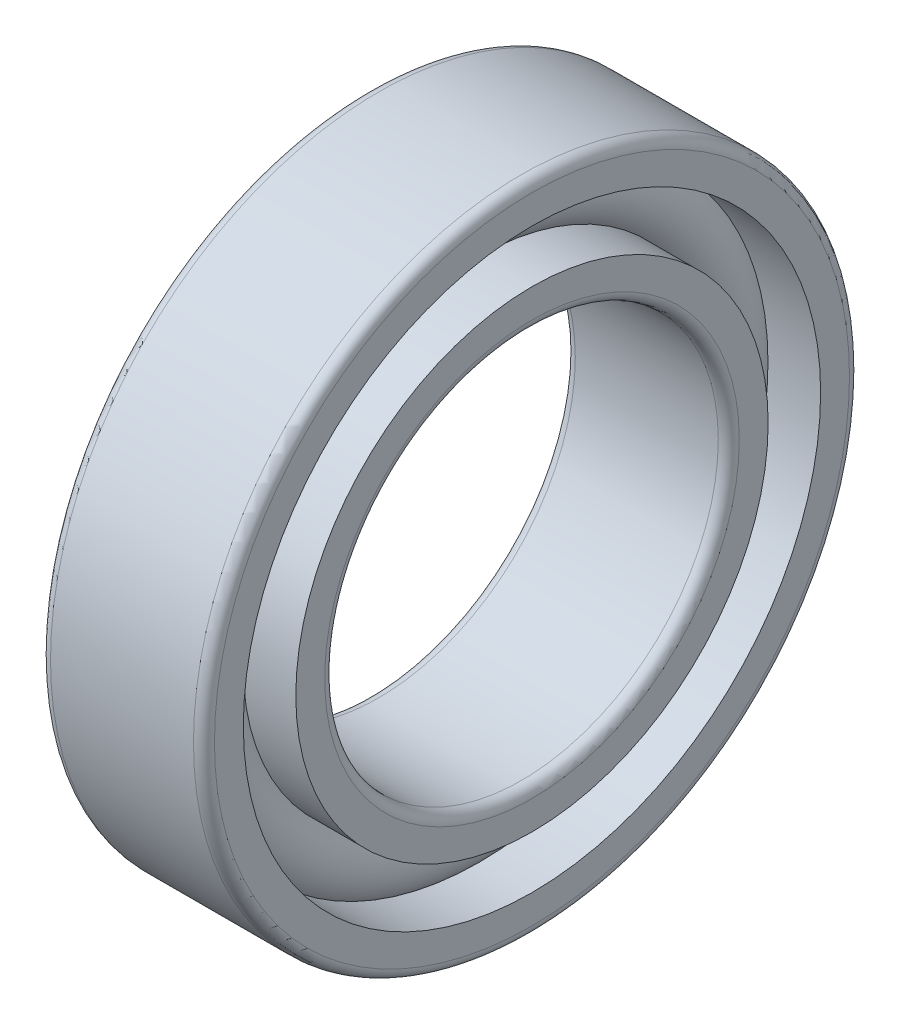
ISO-10303-21;
HEADER;
FILE_DESCRIPTION(('STEP AP214'),'2;1');
FILE_NAME('part.step','',(''),(''),'','','');
FILE_SCHEMA(('AUTOMOTIVE_DESIGN { 1 0 10303 214 1 1 1 1 }'));
ENDSEC;
DATA;
#1=APPLICATION_CONTEXT('core data for automotive mechanical design processes');
#2=APPLICATION_PROTOCOL_DEFINITION('international standard','automotive_design',2000,#1);
#3=PRODUCT_CONTEXT('',#1,'mechanical');
#4=PRODUCT('Part','Part','',(#3));
#5=PRODUCT_RELATED_PRODUCT_CATEGORY('part','',(#4));
#6=PRODUCT_DEFINITION_FORMATION('','',#4);
#7=PRODUCT_DEFINITION_CONTEXT('part definition',#1,'design');
#8=PRODUCT_DEFINITION('design','',#6,#7);
#9=PRODUCT_DEFINITION_SHAPE('','',#8);
#10=(LENGTH_UNIT() NAMED_UNIT(*) SI_UNIT(.MILLI.,.METRE.));
#11=(NAMED_UNIT(*) PLANE_ANGLE_UNIT() SI_UNIT($,.RADIAN.));
#12=(NAMED_UNIT(*) SI_UNIT($,.STERADIAN.) SOLID_ANGLE_UNIT());
#13=UNCERTAINTY_MEASURE_WITH_UNIT(LENGTH_MEASURE(1.E-05),#10,'distance_accuracy_value','');
#14=(GEOMETRIC_REPRESENTATION_CONTEXT(3) GLOBAL_UNCERTAINTY_ASSIGNED_CONTEXT((#13)) GLOBAL_UNIT_ASSIGNED_CONTEXT((#10,
#11,#12)) REPRESENTATION_CONTEXT('',''));
#15=CARTESIAN_POINT('',(0.,0.,0.));
#16=DIRECTION('',(0.,0.,1.));
#17=DIRECTION('',(1.,0.,0.));
#18=AXIS2_PLACEMENT_3D('',#15,#16,#17);
#19=CARTESIAN_POINT('',(0.,0.,0.));
#20=DIRECTION('',(-1.,0.,0.));
#21=DIRECTION('',(0.,0.,1.));
#22=AXIS2_PLACEMENT_3D('',#19,#20,#21);
#23=TOROIDAL_SURFACE('',#22,6.35,0.9525);
#24=CARTESIAN_POINT('',(0.709951582856178,0.,0.));
#25=DIRECTION('',(-1.,0.,0.));
#26=DIRECTION('',(0.,0.,1.));
#27=AXIS2_PLACEMENT_3D('',#24,#25,#26);
#28=CIRCLE('',#27,6.985);
#29=CARTESIAN_POINT('',(0.709951582856178,0.,6.985));
#30=VERTEX_POINT('',#29);
#31=EDGE_CURVE('E41',#30,#30,#28,.F.);
#32=ORIENTED_EDGE('',*,*,#31,.T.);
#33=EDGE_LOOP('',(#32));
#34=FACE_BOUND('',#33,.T.);
#35=CARTESIAN_POINT('',(0.709951582856183,0.,0.));
#36=DIRECTION('',(-1.,0.,0.));
#37=DIRECTION('',(0.,0.,1.));
#38=AXIS2_PLACEMENT_3D('',#35,#36,#37);
#39=CIRCLE('',#38,5.715);
#40=CARTESIAN_POINT('',(0.709951582856183,0.,5.715));
#41=VERTEX_POINT('',#40);
#42=EDGE_CURVE('E10',#41,#41,#39,.T.);
#43=ORIENTED_EDGE('',*,*,#42,.T.);
#44=EDGE_LOOP('',(#43));
#45=FACE_BOUND('',#44,.T.);
#46=ADVANCED_FACE('F40',(#34,#45),#23,.T.);
#47=CARTESIAN_POINT('',(-20.6375,0.,0.));
#48=DIRECTION('',(1.,0.,0.));
#49=DIRECTION('',(0.,0.,-1.));
#50=AXIS2_PLACEMENT_3D('',#47,#48,#49);
#51=CYLINDRICAL_SURFACE('',#50,5.715);
#52=CARTESIAN_POINT('',(1.98374,0.,0.));
#53=DIRECTION('',(1.,0.,0.));
#54=DIRECTION('',(0.,0.,-1.));
#55=AXIS2_PLACEMENT_3D('',#52,#53,#54);
#56=CIRCLE('',#55,5.715);
#57=CARTESIAN_POINT('',(1.98374,0.,-5.715));
#58=VERTEX_POINT('',#57);
#59=EDGE_CURVE('E49',#58,#58,#56,.T.);
#60=ORIENTED_EDGE('',*,*,#59,.F.);
#61=EDGE_LOOP('',(#60));
#62=FACE_BOUND('',#61,.T.);
#63=ORIENTED_EDGE('',*,*,#42,.F.);
#64=EDGE_LOOP('',(#63));
#65=FACE_BOUND('',#64,.T.);
#66=ADVANCED_FACE('F86',(#62,#65),#51,.T.);
#67=CARTESIAN_POINT('',(-20.6375,0.,0.));
#68=DIRECTION('',(1.,0.,0.));
#69=DIRECTION('',(0.,0.,-1.));
#70=AXIS2_PLACEMENT_3D('',#67,#68,#69);
#71=CYLINDRICAL_SURFACE('',#70,5.715);
#72=CARTESIAN_POINT('',(-1.98374,0.,0.));
#73=DIRECTION('',(1.,0.,0.));
#74=DIRECTION('',(0.,0.,-1.));
#75=AXIS2_PLACEMENT_3D('',#72,#73,#74);
#76=CIRCLE('',#75,5.715);
#77=CARTESIAN_POINT('',(-1.98374,0.,-5.715));
#78=VERTEX_POINT('',#77);
#79=EDGE_CURVE('E56',#78,#78,#76,.T.);
#80=ORIENTED_EDGE('',*,*,#79,.T.);
#81=EDGE_LOOP('',(#80));
#82=FACE_BOUND('',#81,.T.);
#83=CARTESIAN_POINT('',(-0.709951582856183,0.,0.));
#84=DIRECTION('',(1.,0.,0.));
#85=DIRECTION('',(0.,0.,-1.));
#86=AXIS2_PLACEMENT_3D('',#83,#84,#85);
#87=CIRCLE('',#86,5.715);
#88=CARTESIAN_POINT('',(-0.709951582856183,0.,-5.715));
#89=VERTEX_POINT('',#88);
#90=EDGE_CURVE('E44',#89,#89,#87,.T.);
#91=ORIENTED_EDGE('',*,*,#90,.F.);
#92=EDGE_LOOP('',(#91));
#93=FACE_BOUND('',#92,.T.);
#94=ADVANCED_FACE('F95',(#82,#93),#71,.T.);
#95=CARTESIAN_POINT('',(1.98374,5.0165,0.));
#96=DIRECTION('',(1.,0.,0.));
#97=DIRECTION('',(0.,0.,-1.));
#98=AXIS2_PLACEMENT_3D('',#95,#96,#97);
#99=PLANE('',#98);
#100=ORIENTED_EDGE('',*,*,#59,.T.);
#101=EDGE_LOOP('',(#100));
#102=FACE_BOUND('',#101,.T.);
#103=CARTESIAN_POINT('',(1.98374,0.,0.));
#104=DIRECTION('',(1.,0.,0.));
#105=DIRECTION('',(0.,0.,-1.));
#106=AXIS2_PLACEMENT_3D('',#103,#104,#105);
#107=CIRCLE('',#106,5.0165);
#108=CARTESIAN_POINT('',(1.98374,0.,-5.0165));
#109=VERTEX_POINT('',#108);
#110=EDGE_CURVE('E82',#109,#109,#107,.T.);
#111=ORIENTED_EDGE('',*,*,#110,.F.);
#112=EDGE_LOOP('',(#111));
#113=FACE_BOUND('',#112,.T.);
#114=ADVANCED_FACE('F87',(#102,#113),#99,.T.);
#115=CARTESIAN_POINT('',(1.72974,0.,0.));
#116=DIRECTION('',(1.,0.,0.));
#117=DIRECTION('',(0.,0.,-1.));
#118=AXIS2_PLACEMENT_3D('',#115,#116,#117);
#119=TOROIDAL_SURFACE('',#118,5.0165,0.254);
#120=ORIENTED_EDGE('',*,*,#110,.T.);
#121=EDGE_LOOP('',(#120));
#122=FACE_BOUND('',#121,.T.);
#123=CARTESIAN_POINT('',(1.72974,0.,0.));
#124=DIRECTION('',(1.,0.,0.));
#125=DIRECTION('',(0.,0.,-1.));
#126=AXIS2_PLACEMENT_3D('',#123,#124,#125);
#127=CIRCLE('',#126,4.7625);
#128=CARTESIAN_POINT('',(1.72974,0.,-4.7625));
#129=VERTEX_POINT('',#128);
#130=EDGE_CURVE('E78',#129,#129,#127,.T.);
#131=ORIENTED_EDGE('',*,*,#130,.F.);
#132=EDGE_LOOP('',(#131));
#133=FACE_BOUND('',#132,.T.);
#134=ADVANCED_FACE('F103',(#122,#133),#119,.T.);
#135=CARTESIAN_POINT('',(-20.6375,0.,0.));
#136=DIRECTION('',(1.,0.,0.));
#137=DIRECTION('',(0.,0.,-1.));
#138=AXIS2_PLACEMENT_3D('',#135,#136,#137);
#139=CYLINDRICAL_SURFACE('',#138,4.7625);
#140=ORIENTED_EDGE('',*,*,#130,.T.);
#141=EDGE_LOOP('',(#140));
#142=FACE_BOUND('',#141,.T.);
#143=CARTESIAN_POINT('',(-1.72974,0.,0.));
#144=DIRECTION('',(1.,0.,0.));
#145=DIRECTION('',(0.,0.,-1.));
#146=AXIS2_PLACEMENT_3D('',#143,#144,#145);
#147=CIRCLE('',#146,4.7625);
#148=CARTESIAN_POINT('',(-1.72974,0.,-4.7625));
#149=VERTEX_POINT('',#148);
#150=EDGE_CURVE('E74',#149,#149,#147,.T.);
#151=ORIENTED_EDGE('',*,*,#150,.F.);
#152=EDGE_LOOP('',(#151));
#153=FACE_BOUND('',#152,.T.);
#154=ADVANCED_FACE('F108',(#142,#153),#139,.F.);
#155=CARTESIAN_POINT('',(-1.72974,0.,0.));
#156=DIRECTION('',(1.,0.,0.));
#157=DIRECTION('',(0.,0.,-1.));
#158=AXIS2_PLACEMENT_3D('',#155,#156,#157);
#159=TOROIDAL_SURFACE('',#158,5.0165,0.254);
#160=ORIENTED_EDGE('',*,*,#150,.T.);
#161=EDGE_LOOP('',(#160));
#162=FACE_BOUND('',#161,.T.);
#163=CARTESIAN_POINT('',(-1.98374,0.,0.));
#164=DIRECTION('',(1.,0.,0.));
#165=DIRECTION('',(0.,0.,-1.));
#166=AXIS2_PLACEMENT_3D('',#163,#164,#165);
#167=CIRCLE('',#166,5.0165);
#168=CARTESIAN_POINT('',(-1.98374,0.,-5.0165));
#169=VERTEX_POINT('',#168);
#170=EDGE_CURVE('E75',#169,#169,#167,.T.);
#171=ORIENTED_EDGE('',*,*,#170,.F.);
#172=EDGE_LOOP('',(#171));
#173=FACE_BOUND('',#172,.T.);
#174=ADVANCED_FACE('F109',(#162,#173),#159,.T.);
#175=CARTESIAN_POINT('',(-1.98374,5.715,0.));
#176=DIRECTION('',(-1.,0.,0.));
#177=DIRECTION('',(0.,0.,1.));
#178=AXIS2_PLACEMENT_3D('',#175,#176,#177);
#179=PLANE('',#178);
#180=ORIENTED_EDGE('',*,*,#170,.T.);
#181=EDGE_LOOP('',(#180));
#182=FACE_BOUND('',#181,.T.);
#183=ORIENTED_EDGE('',*,*,#79,.F.);
#184=EDGE_LOOP('',(#183));
#185=FACE_BOUND('',#184,.T.);
#186=ADVANCED_FACE('F114',(#182,#185),#179,.T.);
#187=CARTESIAN_POINT('',(-0.709951582856178,0.,0.));
#188=DIRECTION('',(1.,0.,0.));
#189=DIRECTION('',(0.,0.,-1.));
#190=AXIS2_PLACEMENT_3D('',#187,#188,#189);
#191=CIRCLE('',#190,6.985);
#192=CARTESIAN_POINT('',(-0.709951582856178,0.,-6.985));
#193=VERTEX_POINT('',#192);
#194=EDGE_CURVE('E52',#193,#193,#191,.F.);
#195=ORIENTED_EDGE('',*,*,#194,.T.);
#196=EDGE_LOOP('',(#195));
#197=FACE_BOUND('',#196,.T.);
#198=ORIENTED_EDGE('',*,*,#90,.T.);
#199=EDGE_LOOP('',(#198));
#200=FACE_BOUND('',#199,.T.);
#201=ADVANCED_FACE('F39',(#197,#200),#23,.T.);
#202=CARTESIAN_POINT('',(-20.6375,0.,0.));
#203=DIRECTION('',(1.,0.,0.));
#204=DIRECTION('',(0.,0.,-1.));
#205=AXIS2_PLACEMENT_3D('',#202,#203,#204);
#206=CYLINDRICAL_SURFACE('',#205,6.985);
#207=CARTESIAN_POINT('',(1.98374,0.,0.));
#208=DIRECTION('',(1.,0.,0.));
#209=DIRECTION('',(0.,0.,-1.));
#210=AXIS2_PLACEMENT_3D('',#207,#208,#209);
#211=CIRCLE('',#210,6.98500000000001);
#212=CARTESIAN_POINT('',(1.98374,0.,-6.98500000000001));
#213=VERTEX_POINT('',#212);
#214=EDGE_CURVE('E54',#213,#213,#211,.T.);
#215=ORIENTED_EDGE('',*,*,#214,.T.);
#216=EDGE_LOOP('',(#215));
#217=FACE_BOUND('',#216,.T.);
#218=ORIENTED_EDGE('',*,*,#31,.F.);
#219=EDGE_LOOP('',(#218));
#220=FACE_BOUND('',#219,.T.);
#221=ADVANCED_FACE('F117',(#217,#220),#206,.F.);
#222=CARTESIAN_POINT('',(-20.6375,0.,0.));
#223=DIRECTION('',(1.,0.,0.));
#224=DIRECTION('',(0.,0.,-1.));
#225=AXIS2_PLACEMENT_3D('',#222,#223,#224);
#226=CYLINDRICAL_SURFACE('',#225,6.985);
#227=CARTESIAN_POINT('',(-1.98374,0.,0.));
#228=DIRECTION('',(1.,0.,0.));
#229=DIRECTION('',(0.,0.,-1.));
#230=AXIS2_PLACEMENT_3D('',#227,#228,#229);
#231=CIRCLE('',#230,6.98500000000001);
#232=CARTESIAN_POINT('',(-1.98374,0.,-6.98500000000001));
#233=VERTEX_POINT('',#232);
#234=EDGE_CURVE('E149',#233,#233,#231,.T.);
#235=ORIENTED_EDGE('',*,*,#234,.F.);
#236=EDGE_LOOP('',(#235));
#237=FACE_BOUND('',#236,.T.);
#238=ORIENTED_EDGE('',*,*,#194,.F.);
#239=EDGE_LOOP('',(#238));
#240=FACE_BOUND('',#239,.T.);
#241=ADVANCED_FACE('F125',(#237,#240),#226,.F.);
#242=CARTESIAN_POINT('',(1.98374,7.68350000000001,0.));
#243=DIRECTION('',(1.,0.,0.));
#244=DIRECTION('',(0.,0.,-1.));
#245=AXIS2_PLACEMENT_3D('',#242,#243,#244);
#246=PLANE('',#245);
#247=CARTESIAN_POINT('',(1.98374,0.,0.));
#248=DIRECTION('',(1.,0.,0.));
#249=DIRECTION('',(0.,0.,-1.));
#250=AXIS2_PLACEMENT_3D('',#247,#248,#249);
#251=CIRCLE('',#250,7.68350000000001);
#252=CARTESIAN_POINT('',(1.98374,0.,-7.68350000000001));
#253=VERTEX_POINT('',#252);
#254=EDGE_CURVE('E62',#253,#253,#251,.T.);
#255=ORIENTED_EDGE('',*,*,#254,.T.);
#256=EDGE_LOOP('',(#255));
#257=FACE_BOUND('',#256,.T.);
#258=ORIENTED_EDGE('',*,*,#214,.F.);
#259=EDGE_LOOP('',(#258));
#260=FACE_BOUND('',#259,.T.);
#261=ADVANCED_FACE('F123',(#257,#260),#246,.T.);
#262=CARTESIAN_POINT('',(1.72974,0.,0.));
#263=DIRECTION('',(1.,0.,0.));
#264=DIRECTION('',(0.,0.,-1.));
#265=AXIS2_PLACEMENT_3D('',#262,#263,#264);
#266=TOROIDAL_SURFACE('',#265,7.68350000000001,0.254);
#267=CARTESIAN_POINT('',(1.72974,0.,0.));
#268=DIRECTION('',(1.,0.,0.));
#269=DIRECTION('',(0.,0.,-1.));
#270=AXIS2_PLACEMENT_3D('',#267,#268,#269);
#271=CIRCLE('',#270,7.93750000000001);
#272=CARTESIAN_POINT('',(1.72974,0.,-7.93750000000001));
#273=VERTEX_POINT('',#272);
#274=EDGE_CURVE('E66',#273,#273,#271,.T.);
#275=ORIENTED_EDGE('',*,*,#274,.T.);
#276=EDGE_LOOP('',(#275));
#277=FACE_BOUND('',#276,.T.);
#278=ORIENTED_EDGE('',*,*,#254,.F.);
#279=EDGE_LOOP('',(#278));
#280=FACE_BOUND('',#279,.T.);
#281=ADVANCED_FACE('F126',(#277,#280),#266,.T.);
#282=CARTESIAN_POINT('',(-20.6375,0.,0.));
#283=DIRECTION('',(1.,0.,0.));
#284=DIRECTION('',(0.,0.,-1.));
#285=AXIS2_PLACEMENT_3D('',#282,#283,#284);
#286=CYLINDRICAL_SURFACE('',#285,7.93750000000001);
#287=CARTESIAN_POINT('',(-1.72974,0.,0.));
#288=DIRECTION('',(1.,0.,0.));
#289=DIRECTION('',(0.,0.,-1.));
#290=AXIS2_PLACEMENT_3D('',#287,#288,#289);
#291=CIRCLE('',#290,7.93750000000001);
#292=CARTESIAN_POINT('',(-1.72974,0.,-7.93750000000001));
#293=VERTEX_POINT('',#292);
#294=EDGE_CURVE('E152',#293,#293,#291,.T.);
#295=ORIENTED_EDGE('',*,*,#294,.T.);
#296=EDGE_LOOP('',(#295));
#297=FACE_BOUND('',#296,.T.);
#298=ORIENTED_EDGE('',*,*,#274,.F.);
#299=EDGE_LOOP('',(#298));
#300=FACE_BOUND('',#299,.T.);
#301=ADVANCED_FACE('F129',(#297,#300),#286,.T.);
#302=CARTESIAN_POINT('',(-1.72974,0.,0.));
#303=DIRECTION('',(1.,0.,0.));
#304=DIRECTION('',(0.,0.,-1.));
#305=AXIS2_PLACEMENT_3D('',#302,#303,#304);
#306=TOROIDAL_SURFACE('',#305,7.68350000000001,0.254);
#307=CARTESIAN_POINT('',(-1.98374,0.,0.));
#308=DIRECTION('',(1.,0.,0.));
#309=DIRECTION('',(0.,0.,-1.));
#310=AXIS2_PLACEMENT_3D('',#307,#308,#309);
#311=CIRCLE('',#310,7.68350000000001);
#312=CARTESIAN_POINT('',(-1.98374,0.,-7.68350000000001));
#313=VERTEX_POINT('',#312);
#314=EDGE_CURVE('E151',#313,#313,#311,.T.);
#315=ORIENTED_EDGE('',*,*,#314,.T.);
#316=EDGE_LOOP('',(#315));
#317=FACE_BOUND('',#316,.T.);
#318=ORIENTED_EDGE('',*,*,#294,.F.);
#319=EDGE_LOOP('',(#318));
#320=FACE_BOUND('',#319,.T.);
#321=ADVANCED_FACE('F131',(#317,#320),#306,.T.);
#322=CARTESIAN_POINT('',(-1.98374,6.98500000000001,0.));
#323=DIRECTION('',(-1.,0.,0.));
#324=DIRECTION('',(0.,0.,1.));
#325=AXIS2_PLACEMENT_3D('',#322,#323,#324);
#326=PLANE('',#325);
#327=ORIENTED_EDGE('',*,*,#234,.T.);
#328=EDGE_LOOP('',(#327));
#329=FACE_BOUND('',#328,.T.);
#330=ORIENTED_EDGE('',*,*,#314,.F.);
#331=EDGE_LOOP('',(#330));
#332=FACE_BOUND('',#331,.T.);
#333=ADVANCED_FACE('F139',(#329,#332),#326,.T.);
#334=CLOSED_SHELL('',(#46,#66,#94,#114,#134,#154,#174,#186,#201,#221,#241,#261,#281,#301,#321,#333));
#335=MANIFOLD_SOLID_BREP('B2',#334);
#336=ADVANCED_BREP_SHAPE_REPRESENTATION('',(#18,#335),#14);
#337=SHAPE_DEFINITION_REPRESENTATION(#9,#336);
ENDSEC;
END-ISO-10303-21;
